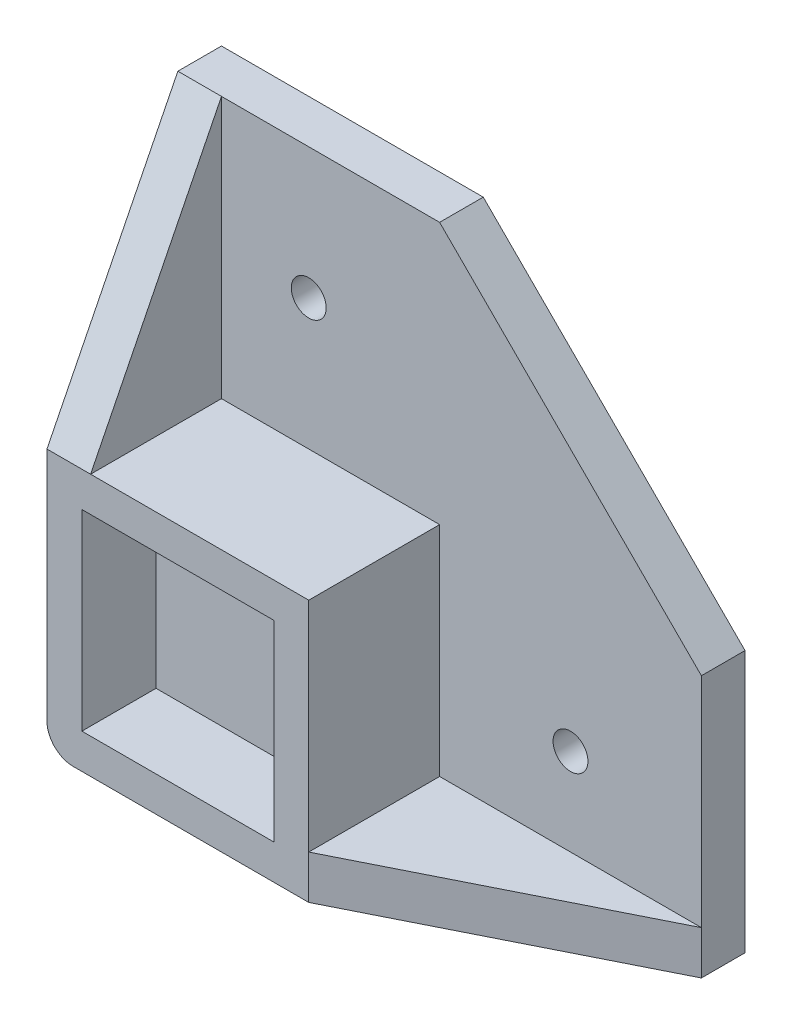
ISO-10303-21;
HEADER;
FILE_DESCRIPTION(('STEP AP214'),'2;1');
FILE_NAME('part.step','',(''),(''),'','','');
FILE_SCHEMA(('AUTOMOTIVE_DESIGN { 1 0 10303 214 1 1 1 1 }'));
ENDSEC;
DATA;
#1=APPLICATION_CONTEXT('core data for automotive mechanical design processes');
#2=APPLICATION_PROTOCOL_DEFINITION('international standard','automotive_design',2000,#1);
#3=PRODUCT_CONTEXT('',#1,'mechanical');
#4=PRODUCT('Part','Part','',(#3));
#5=PRODUCT_RELATED_PRODUCT_CATEGORY('part','',(#4));
#6=PRODUCT_DEFINITION_FORMATION('','',#4);
#7=PRODUCT_DEFINITION_CONTEXT('part definition',#1,'design');
#8=PRODUCT_DEFINITION('design','',#6,#7);
#9=PRODUCT_DEFINITION_SHAPE('','',#8);
#10=(LENGTH_UNIT() NAMED_UNIT(*) SI_UNIT(.MILLI.,.METRE.));
#11=(NAMED_UNIT(*) PLANE_ANGLE_UNIT() SI_UNIT($,.RADIAN.));
#12=(NAMED_UNIT(*) SI_UNIT($,.STERADIAN.) SOLID_ANGLE_UNIT());
#13=UNCERTAINTY_MEASURE_WITH_UNIT(LENGTH_MEASURE(1.E-05),#10,'distance_accuracy_value','');
#14=(GEOMETRIC_REPRESENTATION_CONTEXT(3) GLOBAL_UNCERTAINTY_ASSIGNED_CONTEXT((#13)) GLOBAL_UNIT_ASSIGNED_CONTEXT((#10,
#11,#12)) REPRESENTATION_CONTEXT('',''));
#15=CARTESIAN_POINT('',(0.,0.,0.));
#16=DIRECTION('',(0.,0.,1.));
#17=DIRECTION('',(1.,0.,0.));
#18=AXIS2_PLACEMENT_3D('',#15,#16,#17);
#19=CARTESIAN_POINT('',(0.,0.,5.));
#20=DIRECTION('',(0.,0.,-1.));
#21=DIRECTION('',(-1.,0.,0.));
#22=AXIS2_PLACEMENT_3D('',#19,#20,#21);
#23=PLANE('',#22);
#24=CARTESIAN_POINT('',(45.,15.,5.));
#25=DIRECTION('',(0.,0.,-1.));
#26=DIRECTION('',(-1.,0.,0.));
#27=AXIS2_PLACEMENT_3D('',#24,#25,#26);
#28=CIRCLE('',#27,2.);
#29=CARTESIAN_POINT('',(43.,15.,5.));
#30=VERTEX_POINT('',#29);
#31=EDGE_CURVE('E267',#30,#30,#28,.F.);
#32=ORIENTED_EDGE('',*,*,#31,.F.);
#33=EDGE_LOOP('',(#32));
#34=FACE_BOUND('',#33,.T.);
#35=CARTESIAN_POINT('',(15.,45.,5.));
#36=DIRECTION('',(0.,0.,-1.));
#37=DIRECTION('',(-1.,0.,0.));
#38=AXIS2_PLACEMENT_3D('',#35,#36,#37);
#39=CIRCLE('',#38,2.);
#40=CARTESIAN_POINT('',(13.,45.,5.));
#41=VERTEX_POINT('',#40);
#42=EDGE_CURVE('E268',#41,#41,#39,.F.);
#43=ORIENTED_EDGE('',*,*,#42,.F.);
#44=EDGE_LOOP('',(#43));
#45=FACE_BOUND('',#44,.T.);
#46=DIRECTION('',(0.,-1.,0.));
#47=VECTOR('',#46,1.);
#48=CARTESIAN_POINT('',(5.,60.,5.));
#49=LINE('',#48,#47);
#50=CARTESIAN_POINT('',(5.,60.,5.));
#51=VERTEX_POINT('',#50);
#52=CARTESIAN_POINT('',(5.,30.,5.));
#53=VERTEX_POINT('',#52);
#54=EDGE_CURVE('E198',#51,#53,#49,.T.);
#55=ORIENTED_EDGE('',*,*,#54,.T.);
#56=DIRECTION('',(-1.,0.,0.));
#57=VECTOR('',#56,1.);
#58=CARTESIAN_POINT('',(0.,30.,5.));
#59=LINE('',#58,#57);
#60=CARTESIAN_POINT('',(30.,30.,5.));
#61=VERTEX_POINT('',#60);
#62=EDGE_CURVE('E241',#61,#53,#59,.T.);
#63=ORIENTED_EDGE('',*,*,#62,.F.);
#64=DIRECTION('',(0.,1.,0.));
#65=VECTOR('',#64,1.);
#66=CARTESIAN_POINT('',(30.,0.,5.));
#67=LINE('',#66,#65);
#68=CARTESIAN_POINT('',(30.,5.,5.));
#69=VERTEX_POINT('',#68);
#70=EDGE_CURVE('E233',#69,#61,#67,.T.);
#71=ORIENTED_EDGE('',*,*,#70,.F.);
#72=DIRECTION('',(1.,0.,0.));
#73=VECTOR('',#72,1.);
#74=CARTESIAN_POINT('',(60.,5.,5.));
#75=LINE('',#74,#73);
#76=CARTESIAN_POINT('',(60.,5.,5.));
#77=VERTEX_POINT('',#76);
#78=EDGE_CURVE('E221',#69,#77,#75,.T.);
#79=ORIENTED_EDGE('',*,*,#78,.T.);
#80=DIRECTION('',(0.,1.,0.));
#81=VECTOR('',#80,1.);
#82=CARTESIAN_POINT('',(60.,30.,5.));
#83=LINE('',#82,#81);
#84=CARTESIAN_POINT('',(60.,30.,5.));
#85=VERTEX_POINT('',#84);
#86=EDGE_CURVE('E283',#77,#85,#83,.T.);
#87=ORIENTED_EDGE('',*,*,#86,.T.);
#88=DIRECTION('',(-0.707106781186547,0.707106781186547,0.));
#89=VECTOR('',#88,1.);
#90=CARTESIAN_POINT('',(30.,60.,5.));
#91=LINE('',#90,#89);
#92=CARTESIAN_POINT('',(30.,60.,5.));
#93=VERTEX_POINT('',#92);
#94=EDGE_CURVE('E282',#85,#93,#91,.T.);
#95=ORIENTED_EDGE('',*,*,#94,.T.);
#96=DIRECTION('',(-1.,0.,0.));
#97=VECTOR('',#96,1.);
#98=CARTESIAN_POINT('',(0.,60.,5.));
#99=LINE('',#98,#97);
#100=EDGE_CURVE('E286',#93,#51,#99,.T.);
#101=ORIENTED_EDGE('',*,*,#100,.T.);
#102=EDGE_LOOP('',(#55,#63,#71,#79,#87,#95,#101));
#103=FACE_BOUND('',#102,.T.);
#104=ADVANCED_FACE('F39',(#34,#45,#103),#23,.F.);
#105=CARTESIAN_POINT('',(0.,30.,20.));
#106=DIRECTION('',(0.,-1.,0.));
#107=DIRECTION('',(0.,0.,-1.));
#108=AXIS2_PLACEMENT_3D('',#105,#106,#107);
#109=PLANE('',#108);
#110=DIRECTION('',(0.,0.,1.));
#111=VECTOR('',#110,1.);
#112=CARTESIAN_POINT('',(5.,30.,5.));
#113=LINE('',#112,#111);
#114=CARTESIAN_POINT('',(5.,30.,20.));
#115=VERTEX_POINT('',#114);
#116=EDGE_CURVE('E202',#53,#115,#113,.T.);
#117=ORIENTED_EDGE('',*,*,#116,.T.);
#118=DIRECTION('',(-1.,0.,0.));
#119=VECTOR('',#118,1.);
#120=CARTESIAN_POINT('',(0.,30.,20.));
#121=LINE('',#120,#119);
#122=CARTESIAN_POINT('',(30.,30.,20.));
#123=VERTEX_POINT('',#122);
#124=EDGE_CURVE('E249',#123,#115,#121,.T.);
#125=ORIENTED_EDGE('',*,*,#124,.F.);
#126=DIRECTION('',(0.,0.,-1.));
#127=VECTOR('',#126,1.);
#128=CARTESIAN_POINT('',(30.,30.,20.));
#129=LINE('',#128,#127);
#130=EDGE_CURVE('E253',#123,#61,#129,.T.);
#131=ORIENTED_EDGE('',*,*,#130,.T.);
#132=ORIENTED_EDGE('',*,*,#62,.T.);
#133=EDGE_LOOP('',(#117,#125,#131,#132));
#134=FACE_BOUND('',#133,.T.);
#135=ADVANCED_FACE('F340',(#134),#109,.F.);
#136=CARTESIAN_POINT('',(60.,0.,5.));
#137=DIRECTION('',(0.,1.,0.));
#138=DIRECTION('',(0.,0.,1.));
#139=AXIS2_PLACEMENT_3D('',#136,#137,#138);
#140=PLANE('',#139);
#141=DIRECTION('',(1.,0.,0.));
#142=VECTOR('',#141,1.);
#143=CARTESIAN_POINT('',(0.,0.,20.));
#144=LINE('',#143,#142);
#145=CARTESIAN_POINT('',(3.,0.,20.));
#146=VERTEX_POINT('',#145);
#147=CARTESIAN_POINT('',(30.,0.,20.));
#148=VERTEX_POINT('',#147);
#149=EDGE_CURVE('E240',#146,#148,#144,.T.);
#150=ORIENTED_EDGE('',*,*,#149,.F.);
#151=DIRECTION('',(0.,0.,-1.));
#152=VECTOR('',#151,1.);
#153=CARTESIAN_POINT('',(3.,0.,5.));
#154=LINE('',#153,#152);
#155=CARTESIAN_POINT('',(3.,0.,0.));
#156=VERTEX_POINT('',#155);
#157=EDGE_CURVE('E320',#146,#156,#154,.T.);
#158=ORIENTED_EDGE('',*,*,#157,.T.);
#159=DIRECTION('',(1.,0.,0.));
#160=VECTOR('',#159,1.);
#161=CARTESIAN_POINT('',(60.,0.,0.));
#162=LINE('',#161,#160);
#163=CARTESIAN_POINT('',(60.,0.,0.));
#164=VERTEX_POINT('',#163);
#165=EDGE_CURVE('E272',#156,#164,#162,.T.);
#166=ORIENTED_EDGE('',*,*,#165,.T.);
#167=DIRECTION('',(0.,0.,-1.));
#168=VECTOR('',#167,1.);
#169=CARTESIAN_POINT('',(60.,0.,5.));
#170=LINE('',#169,#168);
#171=CARTESIAN_POINT('',(60.,0.,5.));
#172=VERTEX_POINT('',#171);
#173=EDGE_CURVE('E316',#172,#164,#170,.T.);
#174=ORIENTED_EDGE('',*,*,#173,.F.);
#175=DIRECTION('',(-0.894427190999916,0.,0.447213595499958));
#176=VECTOR('',#175,1.);
#177=CARTESIAN_POINT('',(30.,0.,20.));
#178=LINE('',#177,#176);
#179=EDGE_CURVE('E217',#172,#148,#178,.T.);
#180=ORIENTED_EDGE('',*,*,#179,.T.);
#181=EDGE_LOOP('',(#150,#158,#166,#174,#180));
#182=FACE_BOUND('',#181,.T.);
#183=ADVANCED_FACE('F363',(#182),#140,.F.);
#184=CARTESIAN_POINT('',(60.,30.,5.));
#185=DIRECTION('',(-1.,0.,0.));
#186=DIRECTION('',(0.,0.,1.));
#187=AXIS2_PLACEMENT_3D('',#184,#185,#186);
#188=PLANE('',#187);
#189=DIRECTION('',(0.,1.,0.));
#190=VECTOR('',#189,1.);
#191=CARTESIAN_POINT('',(60.,30.,0.));
#192=LINE('',#191,#190);
#193=CARTESIAN_POINT('',(60.,30.,0.));
#194=VERTEX_POINT('',#193);
#195=EDGE_CURVE('E293',#164,#194,#192,.T.);
#196=ORIENTED_EDGE('',*,*,#195,.T.);
#197=DIRECTION('',(0.,0.,-1.));
#198=VECTOR('',#197,1.);
#199=CARTESIAN_POINT('',(60.,30.,5.));
#200=LINE('',#199,#198);
#201=EDGE_CURVE('E312',#85,#194,#200,.T.);
#202=ORIENTED_EDGE('',*,*,#201,.F.);
#203=ORIENTED_EDGE('',*,*,#86,.F.);
#204=EDGE_CURVE('E279',#172,#77,#83,.T.);
#205=ORIENTED_EDGE('',*,*,#204,.F.);
#206=ORIENTED_EDGE('',*,*,#173,.T.);
#207=EDGE_LOOP('',(#196,#202,#203,#205,#206));
#208=FACE_BOUND('',#207,.T.);
#209=ADVANCED_FACE('F372',(#208),#188,.F.);
#210=CARTESIAN_POINT('',(30.,60.,5.));
#211=DIRECTION('',(-0.707106781186548,-0.707106781186548,0.));
#212=DIRECTION('',(0.707106781186548,-0.707106781186548,0.));
#213=AXIS2_PLACEMENT_3D('',#210,#211,#212);
#214=PLANE('',#213);
#215=DIRECTION('',(-0.707106781186547,0.707106781186547,0.));
#216=VECTOR('',#215,1.);
#217=CARTESIAN_POINT('',(30.,60.,0.));
#218=LINE('',#217,#216);
#219=CARTESIAN_POINT('',(30.,60.,0.));
#220=VERTEX_POINT('',#219);
#221=EDGE_CURVE('E296',#194,#220,#218,.T.);
#222=ORIENTED_EDGE('',*,*,#221,.T.);
#223=DIRECTION('',(0.,0.,-1.));
#224=VECTOR('',#223,1.);
#225=CARTESIAN_POINT('',(30.,60.,5.));
#226=LINE('',#225,#224);
#227=EDGE_CURVE('E308',#93,#220,#226,.T.);
#228=ORIENTED_EDGE('',*,*,#227,.F.);
#229=ORIENTED_EDGE('',*,*,#94,.F.);
#230=ORIENTED_EDGE('',*,*,#201,.T.);
#231=EDGE_LOOP('',(#222,#228,#229,#230));
#232=FACE_BOUND('',#231,.T.);
#233=ADVANCED_FACE('F380',(#232),#214,.F.);
#234=CARTESIAN_POINT('',(0.,60.,5.));
#235=DIRECTION('',(0.,-1.,0.));
#236=DIRECTION('',(0.,0.,-1.));
#237=AXIS2_PLACEMENT_3D('',#234,#235,#236);
#238=PLANE('',#237);
#239=DIRECTION('',(-1.,0.,0.));
#240=VECTOR('',#239,1.);
#241=CARTESIAN_POINT('',(0.,60.,0.));
#242=LINE('',#241,#240);
#243=CARTESIAN_POINT('',(0.,60.,0.));
#244=VERTEX_POINT('',#243);
#245=EDGE_CURVE('E299',#220,#244,#242,.T.);
#246=ORIENTED_EDGE('',*,*,#245,.T.);
#247=DIRECTION('',(0.,0.,-1.));
#248=VECTOR('',#247,1.);
#249=CARTESIAN_POINT('',(0.,60.,5.));
#250=LINE('',#249,#248);
#251=CARTESIAN_POINT('',(0.,60.,5.));
#252=VERTEX_POINT('',#251);
#253=EDGE_CURVE('E290',#252,#244,#250,.T.);
#254=ORIENTED_EDGE('',*,*,#253,.F.);
#255=DIRECTION('',(-1.,0.,0.));
#256=VECTOR('',#255,1.);
#257=CARTESIAN_POINT('',(5.,60.,5.));
#258=LINE('',#257,#256);
#259=EDGE_CURVE('E214',#51,#252,#258,.T.);
#260=ORIENTED_EDGE('',*,*,#259,.F.);
#261=ORIENTED_EDGE('',*,*,#100,.F.);
#262=ORIENTED_EDGE('',*,*,#227,.T.);
#263=EDGE_LOOP('',(#246,#254,#260,#261,#262));
#264=FACE_BOUND('',#263,.T.);
#265=ADVANCED_FACE('F350',(#264),#238,.F.);
#266=CARTESIAN_POINT('',(0.,0.,5.));
#267=DIRECTION('',(1.,0.,0.));
#268=DIRECTION('',(0.,0.,-1.));
#269=AXIS2_PLACEMENT_3D('',#266,#267,#268);
#270=PLANE('',#269);
#271=DIRECTION('',(0.,-1.,0.));
#272=VECTOR('',#271,1.);
#273=CARTESIAN_POINT('',(0.,0.,0.));
#274=LINE('',#273,#272);
#275=CARTESIAN_POINT('',(0.,3.,0.));
#276=VERTEX_POINT('',#275);
#277=EDGE_CURVE('E302',#244,#276,#274,.T.);
#278=ORIENTED_EDGE('',*,*,#277,.T.);
#279=DIRECTION('',(0.,0.,-1.));
#280=VECTOR('',#279,1.);
#281=CARTESIAN_POINT('',(0.,3.,5.));
#282=LINE('',#281,#280);
#283=CARTESIAN_POINT('',(0.,3.,20.));
#284=VERTEX_POINT('',#283);
#285=EDGE_CURVE('E48',#276,#284,#282,.F.);
#286=ORIENTED_EDGE('',*,*,#285,.T.);
#287=DIRECTION('',(0.,-1.,0.));
#288=VECTOR('',#287,1.);
#289=CARTESIAN_POINT('',(0.,0.,20.));
#290=LINE('',#289,#288);
#291=CARTESIAN_POINT('',(0.,30.,20.));
#292=VERTEX_POINT('',#291);
#293=EDGE_CURVE('E237',#292,#284,#290,.T.);
#294=ORIENTED_EDGE('',*,*,#293,.F.);
#295=DIRECTION('',(0.,0.894427190999916,-0.447213595499958));
#296=VECTOR('',#295,1.);
#297=CARTESIAN_POINT('',(0.,30.,20.));
#298=LINE('',#297,#296);
#299=EDGE_CURVE('E192',#292,#252,#298,.T.);
#300=ORIENTED_EDGE('',*,*,#299,.T.);
#301=ORIENTED_EDGE('',*,*,#253,.T.);
#302=EDGE_LOOP('',(#278,#286,#294,#300,#301));
#303=FACE_BOUND('',#302,.T.);
#304=ADVANCED_FACE('F355',(#303),#270,.F.);
#305=CARTESIAN_POINT('',(0.,0.,0.));
#306=DIRECTION('',(0.,0.,-1.));
#307=DIRECTION('',(-1.,0.,0.));
#308=AXIS2_PLACEMENT_3D('',#305,#306,#307);
#309=PLANE('',#308);
#310=CARTESIAN_POINT('',(45.,15.,0.));
#311=DIRECTION('',(0.,0.,-1.));
#312=DIRECTION('',(-1.,0.,0.));
#313=AXIS2_PLACEMENT_3D('',#310,#311,#312);
#314=CIRCLE('',#313,2.);
#315=CARTESIAN_POINT('',(43.,15.,0.));
#316=VERTEX_POINT('',#315);
#317=EDGE_CURVE('E263',#316,#316,#314,.T.);
#318=ORIENTED_EDGE('',*,*,#317,.F.);
#319=EDGE_LOOP('',(#318));
#320=FACE_BOUND('',#319,.T.);
#321=CARTESIAN_POINT('',(15.,45.,0.));
#322=DIRECTION('',(0.,0.,-1.));
#323=DIRECTION('',(-1.,0.,0.));
#324=AXIS2_PLACEMENT_3D('',#321,#322,#323);
#325=CIRCLE('',#324,2.);
#326=CARTESIAN_POINT('',(13.,45.,0.));
#327=VERTEX_POINT('',#326);
#328=EDGE_CURVE('E262',#327,#327,#325,.T.);
#329=ORIENTED_EDGE('',*,*,#328,.F.);
#330=EDGE_LOOP('',(#329));
#331=FACE_BOUND('',#330,.T.);
#332=ORIENTED_EDGE('',*,*,#165,.F.);
#333=CARTESIAN_POINT('',(3.,3.,0.));
#334=DIRECTION('',(0.,0.,-1.));
#335=DIRECTION('',(-1.,0.,0.));
#336=AXIS2_PLACEMENT_3D('',#333,#334,#335);
#337=CIRCLE('',#336,3.);
#338=EDGE_CURVE('E324',#156,#276,#337,.T.);
#339=ORIENTED_EDGE('',*,*,#338,.T.);
#340=ORIENTED_EDGE('',*,*,#277,.F.);
#341=ORIENTED_EDGE('',*,*,#245,.F.);
#342=ORIENTED_EDGE('',*,*,#221,.F.);
#343=ORIENTED_EDGE('',*,*,#195,.F.);
#344=EDGE_LOOP('',(#332,#339,#340,#341,#342,#343));
#345=FACE_BOUND('',#344,.T.);
#346=ADVANCED_FACE('F367',(#320,#331,#345),#309,.T.);
#347=CARTESIAN_POINT('',(15.,45.,5.001));
#348=DIRECTION('',(0.,0.,-1.));
#349=DIRECTION('',(-1.,0.,0.));
#350=AXIS2_PLACEMENT_3D('',#347,#348,#349);
#351=CYLINDRICAL_SURFACE('',#350,2.);
#352=ORIENTED_EDGE('',*,*,#328,.T.);
#353=EDGE_LOOP('',(#352));
#354=FACE_BOUND('',#353,.T.);
#355=ORIENTED_EDGE('',*,*,#42,.T.);
#356=EDGE_LOOP('',(#355));
#357=FACE_BOUND('',#356,.T.);
#358=ADVANCED_FACE('F400',(#354,#357),#351,.F.);
#359=CARTESIAN_POINT('',(45.,15.,5.001));
#360=DIRECTION('',(0.,0.,-1.));
#361=DIRECTION('',(-1.,0.,0.));
#362=AXIS2_PLACEMENT_3D('',#359,#360,#361);
#363=CYLINDRICAL_SURFACE('',#362,2.);
#364=ORIENTED_EDGE('',*,*,#317,.T.);
#365=EDGE_LOOP('',(#364));
#366=FACE_BOUND('',#365,.T.);
#367=ORIENTED_EDGE('',*,*,#31,.T.);
#368=EDGE_LOOP('',(#367));
#369=FACE_BOUND('',#368,.T.);
#370=ADVANCED_FACE('F422',(#366,#369),#363,.F.);
#371=CARTESIAN_POINT('',(30.,0.,20.));
#372=DIRECTION('',(-1.,0.,0.));
#373=DIRECTION('',(0.,0.,1.));
#374=AXIS2_PLACEMENT_3D('',#371,#372,#373);
#375=PLANE('',#374);
#376=DIRECTION('',(0.,1.,0.));
#377=VECTOR('',#376,1.);
#378=CARTESIAN_POINT('',(30.,0.,20.));
#379=LINE('',#378,#377);
#380=CARTESIAN_POINT('',(30.,5.,20.));
#381=VERTEX_POINT('',#380);
#382=EDGE_CURVE('E244',#381,#123,#379,.T.);
#383=ORIENTED_EDGE('',*,*,#382,.F.);
#384=DIRECTION('',(0.,0.,-1.));
#385=VECTOR('',#384,1.);
#386=CARTESIAN_POINT('',(30.,5.,5.));
#387=LINE('',#386,#385);
#388=EDGE_CURVE('E229',#381,#69,#387,.T.);
#389=ORIENTED_EDGE('',*,*,#388,.T.);
#390=ORIENTED_EDGE('',*,*,#70,.T.);
#391=ORIENTED_EDGE('',*,*,#130,.F.);
#392=EDGE_LOOP('',(#383,#389,#390,#391));
#393=FACE_BOUND('',#392,.T.);
#394=ADVANCED_FACE('F336',(#393),#375,.F.);
#395=CARTESIAN_POINT('',(0.,0.,20.));
#396=DIRECTION('',(0.,0.,-1.));
#397=DIRECTION('',(-1.,0.,0.));
#398=AXIS2_PLACEMENT_3D('',#395,#396,#397);
#399=PLANE('',#398);
#400=DIRECTION('',(-1.,0.,0.));
#401=VECTOR('',#400,1.);
#402=CARTESIAN_POINT('',(26.,26.,20.));
#403=LINE('',#402,#401);
#404=CARTESIAN_POINT('',(26.,26.,20.));
#405=VERTEX_POINT('',#404);
#406=CARTESIAN_POINT('',(4.,26.,20.));
#407=VERTEX_POINT('',#406);
#408=EDGE_CURVE('E183',#405,#407,#403,.T.);
#409=ORIENTED_EDGE('',*,*,#408,.F.);
#410=DIRECTION('',(0.,1.,0.));
#411=VECTOR('',#410,1.);
#412=CARTESIAN_POINT('',(26.,26.,20.));
#413=LINE('',#412,#411);
#414=CARTESIAN_POINT('',(26.,4.,20.));
#415=VERTEX_POINT('',#414);
#416=EDGE_CURVE('E55',#415,#405,#413,.T.);
#417=ORIENTED_EDGE('',*,*,#416,.F.);
#418=DIRECTION('',(1.,0.,0.));
#419=VECTOR('',#418,1.);
#420=CARTESIAN_POINT('',(26.,4.,20.));
#421=LINE('',#420,#419);
#422=CARTESIAN_POINT('',(4.,4.,20.));
#423=VERTEX_POINT('',#422);
#424=EDGE_CURVE('E170',#423,#415,#421,.T.);
#425=ORIENTED_EDGE('',*,*,#424,.F.);
#426=DIRECTION('',(0.,-1.,0.));
#427=VECTOR('',#426,1.);
#428=CARTESIAN_POINT('',(4.,26.,20.));
#429=LINE('',#428,#427);
#430=EDGE_CURVE('E174',#407,#423,#429,.T.);
#431=ORIENTED_EDGE('',*,*,#430,.F.);
#432=EDGE_LOOP('',(#409,#417,#425,#431));
#433=FACE_BOUND('',#432,.T.);
#434=ORIENTED_EDGE('',*,*,#293,.T.);
#435=CARTESIAN_POINT('',(3.,3.,20.));
#436=DIRECTION('',(0.,0.,-1.));
#437=DIRECTION('',(-1.,0.,0.));
#438=AXIS2_PLACEMENT_3D('',#435,#436,#437);
#439=CIRCLE('',#438,3.);
#440=EDGE_CURVE('E11',#284,#146,#439,.F.);
#441=ORIENTED_EDGE('',*,*,#440,.T.);
#442=ORIENTED_EDGE('',*,*,#149,.T.);
#443=EDGE_CURVE('E245',#148,#381,#379,.T.);
#444=ORIENTED_EDGE('',*,*,#443,.T.);
#445=ORIENTED_EDGE('',*,*,#382,.T.);
#446=ORIENTED_EDGE('',*,*,#124,.T.);
#447=DIRECTION('',(-1.,0.,0.));
#448=VECTOR('',#447,1.);
#449=CARTESIAN_POINT('',(5.,30.,20.));
#450=LINE('',#449,#448);
#451=EDGE_CURVE('E210',#115,#292,#450,.T.);
#452=ORIENTED_EDGE('',*,*,#451,.T.);
#453=EDGE_LOOP('',(#434,#441,#442,#444,#445,#446,#452));
#454=FACE_BOUND('',#453,.T.);
#455=ADVANCED_FACE('F332',(#433,#454),#399,.F.);
#456=CARTESIAN_POINT('',(30.,5.,20.));
#457=DIRECTION('',(0.447213595499958,0.,0.894427190999916));
#458=DIRECTION('',(0.894427190999916,0.,-0.447213595499958));
#459=AXIS2_PLACEMENT_3D('',#456,#457,#458);
#460=PLANE('',#459);
#461=ORIENTED_EDGE('',*,*,#179,.F.);
#462=ORIENTED_EDGE('',*,*,#204,.T.);
#463=DIRECTION('',(-0.894427190999916,0.,0.447213595499958));
#464=VECTOR('',#463,1.);
#465=CARTESIAN_POINT('',(30.,5.,20.));
#466=LINE('',#465,#464);
#467=EDGE_CURVE('E225',#77,#381,#466,.T.);
#468=ORIENTED_EDGE('',*,*,#467,.T.);
#469=ORIENTED_EDGE('',*,*,#443,.F.);
#470=EDGE_LOOP('',(#461,#462,#468,#469));
#471=FACE_BOUND('',#470,.T.);
#472=ADVANCED_FACE('F375',(#471),#460,.T.);
#473=CARTESIAN_POINT('',(0.,5.,0.));
#474=DIRECTION('',(0.,1.,0.));
#475=DIRECTION('',(0.,0.,1.));
#476=AXIS2_PLACEMENT_3D('',#473,#474,#475);
#477=PLANE('',#476);
#478=ORIENTED_EDGE('',*,*,#78,.F.);
#479=ORIENTED_EDGE('',*,*,#388,.F.);
#480=ORIENTED_EDGE('',*,*,#467,.F.);
#481=EDGE_LOOP('',(#478,#479,#480));
#482=FACE_BOUND('',#481,.T.);
#483=ADVANCED_FACE('F378',(#482),#477,.T.);
#484=CARTESIAN_POINT('',(5.,30.,20.));
#485=DIRECTION('',(0.,0.447213595499958,0.894427190999916));
#486=DIRECTION('',(0.,-0.894427190999916,0.447213595499958));
#487=AXIS2_PLACEMENT_3D('',#484,#485,#486);
#488=PLANE('',#487);
#489=ORIENTED_EDGE('',*,*,#299,.F.);
#490=ORIENTED_EDGE('',*,*,#451,.F.);
#491=DIRECTION('',(0.,0.894427190999916,-0.447213595499958));
#492=VECTOR('',#491,1.);
#493=CARTESIAN_POINT('',(5.,30.,20.));
#494=LINE('',#493,#492);
#495=EDGE_CURVE('E206',#115,#51,#494,.T.);
#496=ORIENTED_EDGE('',*,*,#495,.T.);
#497=ORIENTED_EDGE('',*,*,#259,.T.);
#498=EDGE_LOOP('',(#489,#490,#496,#497));
#499=FACE_BOUND('',#498,.T.);
#500=ADVANCED_FACE('F354',(#499),#488,.T.);
#501=CARTESIAN_POINT('',(5.,0.,0.));
#502=DIRECTION('',(-1.,0.,0.));
#503=DIRECTION('',(0.,0.,1.));
#504=AXIS2_PLACEMENT_3D('',#501,#502,#503);
#505=PLANE('',#504);
#506=ORIENTED_EDGE('',*,*,#54,.F.);
#507=ORIENTED_EDGE('',*,*,#495,.F.);
#508=ORIENTED_EDGE('',*,*,#116,.F.);
#509=EDGE_LOOP('',(#506,#507,#508));
#510=FACE_BOUND('',#509,.T.);
#511=ADVANCED_FACE('F343',(#510),#505,.F.);
#512=CARTESIAN_POINT('',(3.,3.,5.));
#513=DIRECTION('',(0.,0.,-1.));
#514=DIRECTION('',(-1.,0.,0.));
#515=AXIS2_PLACEMENT_3D('',#512,#513,#514);
#516=CYLINDRICAL_SURFACE('',#515,3.);
#517=ORIENTED_EDGE('',*,*,#440,.F.);
#518=ORIENTED_EDGE('',*,*,#285,.F.);
#519=ORIENTED_EDGE('',*,*,#338,.F.);
#520=ORIENTED_EDGE('',*,*,#157,.F.);
#521=EDGE_LOOP('',(#517,#518,#519,#520));
#522=FACE_BOUND('',#521,.T.);
#523=ADVANCED_FACE('F41',(#522),#516,.T.);
#524=CARTESIAN_POINT('',(26.,26.,11.5));
#525=DIRECTION('',(1.,0.,0.));
#526=DIRECTION('',(0.,1.,0.));
#527=AXIS2_PLACEMENT_3D('',#524,#525,#526);
#528=PLANE('',#527);
#529=ORIENTED_EDGE('',*,*,#416,.T.);
#530=DIRECTION('',(0.,0.,1.));
#531=VECTOR('',#530,1.);
#532=CARTESIAN_POINT('',(26.,26.,11.5));
#533=LINE('',#532,#531);
#534=CARTESIAN_POINT('',(26.,26.,11.5));
#535=VERTEX_POINT('',#534);
#536=EDGE_CURVE('E145',#535,#405,#533,.T.);
#537=ORIENTED_EDGE('',*,*,#536,.F.);
#538=DIRECTION('',(0.,1.,0.));
#539=VECTOR('',#538,1.);
#540=CARTESIAN_POINT('',(26.,26.,11.5));
#541=LINE('',#540,#539);
#542=CARTESIAN_POINT('',(26.,4.,11.5));
#543=VERTEX_POINT('',#542);
#544=EDGE_CURVE('E149',#543,#535,#541,.T.);
#545=ORIENTED_EDGE('',*,*,#544,.F.);
#546=DIRECTION('',(0.,0.,1.));
#547=VECTOR('',#546,1.);
#548=CARTESIAN_POINT('',(26.,4.,11.5));
#549=LINE('',#548,#547);
#550=EDGE_CURVE('E189',#543,#415,#549,.T.);
#551=ORIENTED_EDGE('',*,*,#550,.T.);
#552=EDGE_LOOP('',(#529,#537,#545,#551));
#553=FACE_BOUND('',#552,.T.);
#554=ADVANCED_FACE('F147',(#553),#528,.F.);
#555=CARTESIAN_POINT('',(26.,4.,11.5));
#556=DIRECTION('',(0.,-1.,0.));
#557=DIRECTION('',(1.,0.,0.));
#558=AXIS2_PLACEMENT_3D('',#555,#556,#557);
#559=PLANE('',#558);
#560=ORIENTED_EDGE('',*,*,#424,.T.);
#561=ORIENTED_EDGE('',*,*,#550,.F.);
#562=DIRECTION('',(1.,0.,0.));
#563=VECTOR('',#562,1.);
#564=CARTESIAN_POINT('',(26.,4.,11.5));
#565=LINE('',#564,#563);
#566=CARTESIAN_POINT('',(4.,4.,11.5));
#567=VERTEX_POINT('',#566);
#568=EDGE_CURVE('E156',#567,#543,#565,.T.);
#569=ORIENTED_EDGE('',*,*,#568,.F.);
#570=DIRECTION('',(0.,0.,1.));
#571=VECTOR('',#570,1.);
#572=CARTESIAN_POINT('',(4.,4.,11.5));
#573=LINE('',#572,#571);
#574=EDGE_CURVE('E193',#567,#423,#573,.T.);
#575=ORIENTED_EDGE('',*,*,#574,.T.);
#576=EDGE_LOOP('',(#560,#561,#569,#575));
#577=FACE_BOUND('',#576,.T.);
#578=ADVANCED_FACE('F477',(#577),#559,.F.);
#579=CARTESIAN_POINT('',(4.,26.,11.5));
#580=DIRECTION('',(-1.,0.,0.));
#581=DIRECTION('',(0.,-1.,0.));
#582=AXIS2_PLACEMENT_3D('',#579,#580,#581);
#583=PLANE('',#582);
#584=ORIENTED_EDGE('',*,*,#430,.T.);
#585=ORIENTED_EDGE('',*,*,#574,.F.);
#586=DIRECTION('',(0.,-1.,0.));
#587=VECTOR('',#586,1.);
#588=CARTESIAN_POINT('',(4.,26.,11.5));
#589=LINE('',#588,#587);
#590=CARTESIAN_POINT('',(4.,26.,11.5));
#591=VERTEX_POINT('',#590);
#592=EDGE_CURVE('E165',#591,#567,#589,.T.);
#593=ORIENTED_EDGE('',*,*,#592,.F.);
#594=DIRECTION('',(0.,0.,1.));
#595=VECTOR('',#594,1.);
#596=CARTESIAN_POINT('',(4.,26.,11.5));
#597=LINE('',#596,#595);
#598=EDGE_CURVE('E155',#591,#407,#597,.T.);
#599=ORIENTED_EDGE('',*,*,#598,.T.);
#600=EDGE_LOOP('',(#584,#585,#593,#599));
#601=FACE_BOUND('',#600,.T.);
#602=ADVANCED_FACE('F484',(#601),#583,.F.);
#603=CARTESIAN_POINT('',(26.,26.,11.5));
#604=DIRECTION('',(0.,1.,0.));
#605=DIRECTION('',(-1.,0.,0.));
#606=AXIS2_PLACEMENT_3D('',#603,#604,#605);
#607=PLANE('',#606);
#608=ORIENTED_EDGE('',*,*,#408,.T.);
#609=ORIENTED_EDGE('',*,*,#598,.F.);
#610=DIRECTION('',(-1.,0.,0.));
#611=VECTOR('',#610,1.);
#612=CARTESIAN_POINT('',(26.,26.,11.5));
#613=LINE('',#612,#611);
#614=EDGE_CURVE('E159',#535,#591,#613,.T.);
#615=ORIENTED_EDGE('',*,*,#614,.F.);
#616=ORIENTED_EDGE('',*,*,#536,.T.);
#617=EDGE_LOOP('',(#608,#609,#615,#616));
#618=FACE_BOUND('',#617,.T.);
#619=ADVANCED_FACE('F160',(#618),#607,.F.);
#620=CARTESIAN_POINT('',(0.,0.,11.5));
#621=DIRECTION('',(0.,0.,-1.));
#622=DIRECTION('',(-1.,0.,0.));
#623=AXIS2_PLACEMENT_3D('',#620,#621,#622);
#624=PLANE('',#623);
#625=ORIENTED_EDGE('',*,*,#544,.T.);
#626=ORIENTED_EDGE('',*,*,#614,.T.);
#627=ORIENTED_EDGE('',*,*,#592,.T.);
#628=ORIENTED_EDGE('',*,*,#568,.T.);
#629=EDGE_LOOP('',(#625,#626,#627,#628));
#630=FACE_BOUND('',#629,.T.);
#631=ADVANCED_FACE('F167',(#630),#624,.F.);
#632=CLOSED_SHELL('',(#104,#135,#183,#209,#233,#265,#304,#346,#358,#370,#394,#455,#472,#483,
#500,#511,#523,#554,#578,#602,#619,#631));
#633=MANIFOLD_SOLID_BREP('B2',#632);
#634=ADVANCED_BREP_SHAPE_REPRESENTATION('',(#18,#633),#14);
#635=SHAPE_DEFINITION_REPRESENTATION(#9,#634);
ENDSEC;
END-ISO-10303-21;
